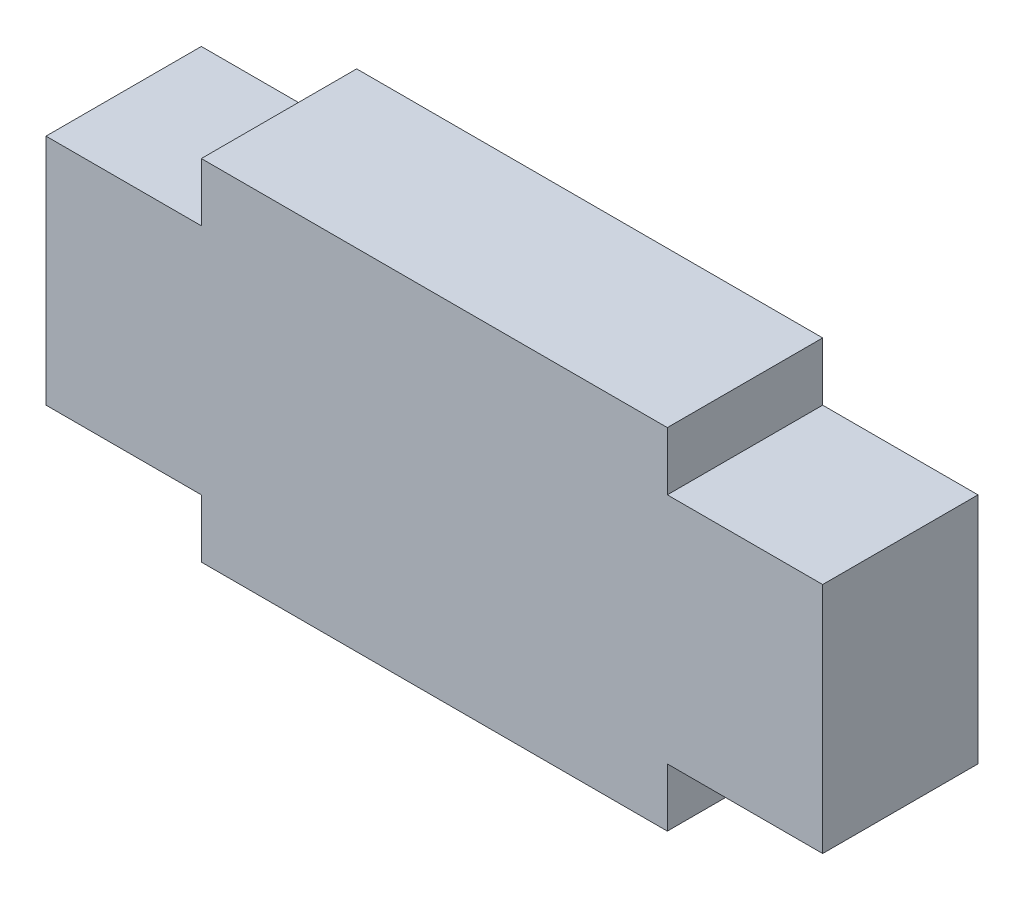
ISO-10303-21;
HEADER;
FILE_DESCRIPTION(('STEP AP214'),'2;1');
FILE_NAME('part.step','',(''),(''),'','','');
FILE_SCHEMA(('AUTOMOTIVE_DESIGN { 1 0 10303 214 1 1 1 1 }'));
ENDSEC;
DATA;
#1=APPLICATION_CONTEXT('core data for automotive mechanical design processes');
#2=APPLICATION_PROTOCOL_DEFINITION('international standard','automotive_design',2000,#1);
#3=PRODUCT_CONTEXT('',#1,'mechanical');
#4=PRODUCT('Part','Part','',(#3));
#5=PRODUCT_RELATED_PRODUCT_CATEGORY('part','',(#4));
#6=PRODUCT_DEFINITION_FORMATION('','',#4);
#7=PRODUCT_DEFINITION_CONTEXT('part definition',#1,'design');
#8=PRODUCT_DEFINITION('design','',#6,#7);
#9=PRODUCT_DEFINITION_SHAPE('','',#8);
#10=(LENGTH_UNIT() NAMED_UNIT(*) SI_UNIT(.MILLI.,.METRE.));
#11=(NAMED_UNIT(*) PLANE_ANGLE_UNIT() SI_UNIT($,.RADIAN.));
#12=(NAMED_UNIT(*) SI_UNIT($,.STERADIAN.) SOLID_ANGLE_UNIT());
#13=UNCERTAINTY_MEASURE_WITH_UNIT(LENGTH_MEASURE(1.E-05),#10,'distance_accuracy_value','');
#14=(GEOMETRIC_REPRESENTATION_CONTEXT(3) GLOBAL_UNCERTAINTY_ASSIGNED_CONTEXT((#13)) GLOBAL_UNIT_ASSIGNED_CONTEXT((#10,
#11,#12)) REPRESENTATION_CONTEXT('',''));
#15=CARTESIAN_POINT('',(0.,0.,0.));
#16=DIRECTION('',(0.,0.,1.));
#17=DIRECTION('',(1.,0.,0.));
#18=AXIS2_PLACEMENT_3D('',#15,#16,#17);
#19=CARTESIAN_POINT('',(4.,0.,4.));
#20=DIRECTION('',(0.,1.,0.));
#21=DIRECTION('',(-1.,0.,0.));
#22=AXIS2_PLACEMENT_3D('',#19,#20,#21);
#23=PLANE('',#22);
#24=DIRECTION('',(1.,0.,0.));
#25=VECTOR('',#24,1.);
#26=CARTESIAN_POINT('',(4.,0.,0.));
#27=LINE('',#26,#25);
#28=CARTESIAN_POINT('',(0.,0.,0.));
#29=VERTEX_POINT('',#28);
#30=CARTESIAN_POINT('',(4.,0.,0.));
#31=VERTEX_POINT('',#30);
#32=EDGE_CURVE('E156',#29,#31,#27,.T.);
#33=ORIENTED_EDGE('',*,*,#32,.T.);
#34=DIRECTION('',(0.,0.,-1.));
#35=VECTOR('',#34,1.);
#36=CARTESIAN_POINT('',(4.,0.,4.));
#37=LINE('',#36,#35);
#38=CARTESIAN_POINT('',(4.,0.,4.));
#39=VERTEX_POINT('',#38);
#40=EDGE_CURVE('E11',#39,#31,#37,.T.);
#41=ORIENTED_EDGE('',*,*,#40,.F.);
#42=DIRECTION('',(1.,0.,0.));
#43=VECTOR('',#42,1.);
#44=CARTESIAN_POINT('',(4.,0.,4.));
#45=LINE('',#44,#43);
#46=CARTESIAN_POINT('',(0.,0.,4.));
#47=VERTEX_POINT('',#46);
#48=EDGE_CURVE('E178',#47,#39,#45,.T.);
#49=ORIENTED_EDGE('',*,*,#48,.F.);
#50=DIRECTION('',(0.,0.,-1.));
#51=VECTOR('',#50,1.);
#52=CARTESIAN_POINT('',(0.,0.,4.));
#53=LINE('',#52,#51);
#54=EDGE_CURVE('E152',#47,#29,#53,.T.);
#55=ORIENTED_EDGE('',*,*,#54,.T.);
#56=EDGE_LOOP('',(#33,#41,#49,#55));
#57=FACE_BOUND('',#56,.T.);
#58=ADVANCED_FACE('F36',(#57),#23,.F.);
#59=CARTESIAN_POINT('',(4.,-1.5,4.));
#60=DIRECTION('',(1.,0.,0.));
#61=DIRECTION('',(0.,0.,-1.));
#62=AXIS2_PLACEMENT_3D('',#59,#60,#61);
#63=PLANE('',#62);
#64=DIRECTION('',(0.,-1.,0.));
#65=VECTOR('',#64,1.);
#66=CARTESIAN_POINT('',(4.,-1.5,0.));
#67=LINE('',#66,#65);
#68=CARTESIAN_POINT('',(4.,-1.5,0.));
#69=VERTEX_POINT('',#68);
#70=EDGE_CURVE('E159',#31,#69,#67,.T.);
#71=ORIENTED_EDGE('',*,*,#70,.T.);
#72=DIRECTION('',(0.,0.,-1.));
#73=VECTOR('',#72,1.);
#74=CARTESIAN_POINT('',(4.,-1.5,4.));
#75=LINE('',#74,#73);
#76=CARTESIAN_POINT('',(4.,-1.5,4.));
#77=VERTEX_POINT('',#76);
#78=EDGE_CURVE('E44',#77,#69,#75,.T.);
#79=ORIENTED_EDGE('',*,*,#78,.F.);
#80=DIRECTION('',(0.,-1.,0.));
#81=VECTOR('',#80,1.);
#82=CARTESIAN_POINT('',(4.,-1.5,4.));
#83=LINE('',#82,#81);
#84=EDGE_CURVE('E107',#39,#77,#83,.T.);
#85=ORIENTED_EDGE('',*,*,#84,.F.);
#86=ORIENTED_EDGE('',*,*,#40,.T.);
#87=EDGE_LOOP('',(#71,#79,#85,#86));
#88=FACE_BOUND('',#87,.T.);
#89=ADVANCED_FACE('F256',(#88),#63,.F.);
#90=CARTESIAN_POINT('',(16.,-1.5,4.));
#91=DIRECTION('',(0.,1.,0.));
#92=DIRECTION('',(0.,0.,1.));
#93=AXIS2_PLACEMENT_3D('',#90,#91,#92);
#94=PLANE('',#93);
#95=DIRECTION('',(1.,0.,0.));
#96=VECTOR('',#95,1.);
#97=CARTESIAN_POINT('',(16.,-1.5,0.));
#98=LINE('',#97,#96);
#99=CARTESIAN_POINT('',(16.,-1.5,0.));
#100=VERTEX_POINT('',#99);
#101=EDGE_CURVE('E161',#69,#100,#98,.T.);
#102=ORIENTED_EDGE('',*,*,#101,.T.);
#103=DIRECTION('',(0.,0.,-1.));
#104=VECTOR('',#103,1.);
#105=CARTESIAN_POINT('',(16.,-1.5,4.));
#106=LINE('',#105,#104);
#107=CARTESIAN_POINT('',(16.,-1.5,4.));
#108=VERTEX_POINT('',#107);
#109=EDGE_CURVE('E197',#108,#100,#106,.T.);
#110=ORIENTED_EDGE('',*,*,#109,.F.);
#111=DIRECTION('',(1.,0.,0.));
#112=VECTOR('',#111,1.);
#113=CARTESIAN_POINT('',(16.,-1.5,4.));
#114=LINE('',#113,#112);
#115=EDGE_CURVE('E205',#77,#108,#114,.T.);
#116=ORIENTED_EDGE('',*,*,#115,.F.);
#117=ORIENTED_EDGE('',*,*,#78,.T.);
#118=EDGE_LOOP('',(#102,#110,#116,#117));
#119=FACE_BOUND('',#118,.T.);
#120=ADVANCED_FACE('F203',(#119),#94,.F.);
#121=CARTESIAN_POINT('',(16.,0.,4.));
#122=DIRECTION('',(-1.,0.,0.));
#123=DIRECTION('',(0.,0.,1.));
#124=AXIS2_PLACEMENT_3D('',#121,#122,#123);
#125=PLANE('',#124);
#126=DIRECTION('',(0.,1.,0.));
#127=VECTOR('',#126,1.);
#128=CARTESIAN_POINT('',(16.,0.,0.));
#129=LINE('',#128,#127);
#130=CARTESIAN_POINT('',(16.,0.,0.));
#131=VERTEX_POINT('',#130);
#132=EDGE_CURVE('E163',#100,#131,#129,.T.);
#133=ORIENTED_EDGE('',*,*,#132,.T.);
#134=DIRECTION('',(0.,0.,-1.));
#135=VECTOR('',#134,1.);
#136=CARTESIAN_POINT('',(16.,0.,4.));
#137=LINE('',#136,#135);
#138=CARTESIAN_POINT('',(16.,0.,4.));
#139=VERTEX_POINT('',#138);
#140=EDGE_CURVE('E194',#139,#131,#137,.T.);
#141=ORIENTED_EDGE('',*,*,#140,.F.);
#142=DIRECTION('',(0.,1.,0.));
#143=VECTOR('',#142,1.);
#144=CARTESIAN_POINT('',(16.,0.,4.));
#145=LINE('',#144,#143);
#146=EDGE_CURVE('E223',#108,#139,#145,.T.);
#147=ORIENTED_EDGE('',*,*,#146,.F.);
#148=ORIENTED_EDGE('',*,*,#109,.T.);
#149=EDGE_LOOP('',(#133,#141,#147,#148));
#150=FACE_BOUND('',#149,.T.);
#151=ADVANCED_FACE('F214',(#150),#125,.F.);
#152=CARTESIAN_POINT('',(20.,0.,4.));
#153=DIRECTION('',(0.,1.,0.));
#154=DIRECTION('',(-1.,0.,0.));
#155=AXIS2_PLACEMENT_3D('',#152,#153,#154);
#156=PLANE('',#155);
#157=DIRECTION('',(1.,0.,0.));
#158=VECTOR('',#157,1.);
#159=CARTESIAN_POINT('',(20.,0.,0.));
#160=LINE('',#159,#158);
#161=CARTESIAN_POINT('',(20.,0.,0.));
#162=VERTEX_POINT('',#161);
#163=EDGE_CURVE('E165',#131,#162,#160,.T.);
#164=ORIENTED_EDGE('',*,*,#163,.T.);
#165=DIRECTION('',(0.,0.,-1.));
#166=VECTOR('',#165,1.);
#167=CARTESIAN_POINT('',(20.,0.,4.));
#168=LINE('',#167,#166);
#169=CARTESIAN_POINT('',(20.,0.,4.));
#170=VERTEX_POINT('',#169);
#171=EDGE_CURVE('E191',#170,#162,#168,.T.);
#172=ORIENTED_EDGE('',*,*,#171,.F.);
#173=DIRECTION('',(1.,0.,0.));
#174=VECTOR('',#173,1.);
#175=CARTESIAN_POINT('',(20.,0.,4.));
#176=LINE('',#175,#174);
#177=EDGE_CURVE('E220',#139,#170,#176,.T.);
#178=ORIENTED_EDGE('',*,*,#177,.F.);
#179=ORIENTED_EDGE('',*,*,#140,.T.);
#180=EDGE_LOOP('',(#164,#172,#178,#179));
#181=FACE_BOUND('',#180,.T.);
#182=ADVANCED_FACE('F218',(#181),#156,.F.);
#183=CARTESIAN_POINT('',(20.,6.,4.));
#184=DIRECTION('',(-1.,0.,0.));
#185=DIRECTION('',(0.,0.,1.));
#186=AXIS2_PLACEMENT_3D('',#183,#184,#185);
#187=PLANE('',#186);
#188=DIRECTION('',(0.,1.,0.));
#189=VECTOR('',#188,1.);
#190=CARTESIAN_POINT('',(20.,6.,0.));
#191=LINE('',#190,#189);
#192=CARTESIAN_POINT('',(20.,6.,0.));
#193=VERTEX_POINT('',#192);
#194=EDGE_CURVE('E167',#162,#193,#191,.T.);
#195=ORIENTED_EDGE('',*,*,#194,.T.);
#196=DIRECTION('',(0.,0.,-1.));
#197=VECTOR('',#196,1.);
#198=CARTESIAN_POINT('',(20.,6.,4.));
#199=LINE('',#198,#197);
#200=CARTESIAN_POINT('',(20.,6.,4.));
#201=VERTEX_POINT('',#200);
#202=EDGE_CURVE('E188',#201,#193,#199,.T.);
#203=ORIENTED_EDGE('',*,*,#202,.F.);
#204=DIRECTION('',(0.,1.,0.));
#205=VECTOR('',#204,1.);
#206=CARTESIAN_POINT('',(20.,6.,4.));
#207=LINE('',#206,#205);
#208=EDGE_CURVE('E222',#170,#201,#207,.T.);
#209=ORIENTED_EDGE('',*,*,#208,.F.);
#210=ORIENTED_EDGE('',*,*,#171,.T.);
#211=EDGE_LOOP('',(#195,#203,#209,#210));
#212=FACE_BOUND('',#211,.T.);
#213=ADVANCED_FACE('F269',(#212),#187,.F.);
#214=CARTESIAN_POINT('',(16.,6.,4.));
#215=DIRECTION('',(0.,-1.,0.));
#216=DIRECTION('',(1.,0.,0.));
#217=AXIS2_PLACEMENT_3D('',#214,#215,#216);
#218=PLANE('',#217);
#219=DIRECTION('',(-1.,0.,0.));
#220=VECTOR('',#219,1.);
#221=CARTESIAN_POINT('',(16.,6.,0.));
#222=LINE('',#221,#220);
#223=CARTESIAN_POINT('',(16.,6.,0.));
#224=VERTEX_POINT('',#223);
#225=EDGE_CURVE('E169',#193,#224,#222,.T.);
#226=ORIENTED_EDGE('',*,*,#225,.T.);
#227=DIRECTION('',(0.,0.,-1.));
#228=VECTOR('',#227,1.);
#229=CARTESIAN_POINT('',(16.,6.,4.));
#230=LINE('',#229,#228);
#231=CARTESIAN_POINT('',(16.,6.,4.));
#232=VERTEX_POINT('',#231);
#233=EDGE_CURVE('E185',#232,#224,#230,.T.);
#234=ORIENTED_EDGE('',*,*,#233,.F.);
#235=DIRECTION('',(-1.,0.,0.));
#236=VECTOR('',#235,1.);
#237=CARTESIAN_POINT('',(16.,6.,4.));
#238=LINE('',#237,#236);
#239=EDGE_CURVE('E225',#201,#232,#238,.T.);
#240=ORIENTED_EDGE('',*,*,#239,.F.);
#241=ORIENTED_EDGE('',*,*,#202,.T.);
#242=EDGE_LOOP('',(#226,#234,#240,#241));
#243=FACE_BOUND('',#242,.T.);
#244=ADVANCED_FACE('F272',(#243),#218,.F.);
#245=CARTESIAN_POINT('',(16.,7.5,4.));
#246=DIRECTION('',(-1.,0.,0.));
#247=DIRECTION('',(0.,0.,1.));
#248=AXIS2_PLACEMENT_3D('',#245,#246,#247);
#249=PLANE('',#248);
#250=DIRECTION('',(0.,1.,0.));
#251=VECTOR('',#250,1.);
#252=CARTESIAN_POINT('',(16.,7.5,0.));
#253=LINE('',#252,#251);
#254=CARTESIAN_POINT('',(16.,7.5,0.));
#255=VERTEX_POINT('',#254);
#256=EDGE_CURVE('E171',#224,#255,#253,.T.);
#257=ORIENTED_EDGE('',*,*,#256,.T.);
#258=DIRECTION('',(0.,0.,-1.));
#259=VECTOR('',#258,1.);
#260=CARTESIAN_POINT('',(16.,7.5,4.));
#261=LINE('',#260,#259);
#262=CARTESIAN_POINT('',(16.,7.5,4.));
#263=VERTEX_POINT('',#262);
#264=EDGE_CURVE('E182',#263,#255,#261,.T.);
#265=ORIENTED_EDGE('',*,*,#264,.F.);
#266=DIRECTION('',(0.,1.,0.));
#267=VECTOR('',#266,1.);
#268=CARTESIAN_POINT('',(16.,7.5,4.));
#269=LINE('',#268,#267);
#270=EDGE_CURVE('E231',#232,#263,#269,.T.);
#271=ORIENTED_EDGE('',*,*,#270,.F.);
#272=ORIENTED_EDGE('',*,*,#233,.T.);
#273=EDGE_LOOP('',(#257,#265,#271,#272));
#274=FACE_BOUND('',#273,.T.);
#275=ADVANCED_FACE('F237',(#274),#249,.F.);
#276=CARTESIAN_POINT('',(4.,7.5,4.));
#277=DIRECTION('',(0.,-1.,0.));
#278=DIRECTION('',(0.,0.,-1.));
#279=AXIS2_PLACEMENT_3D('',#276,#277,#278);
#280=PLANE('',#279);
#281=DIRECTION('',(-1.,0.,0.));
#282=VECTOR('',#281,1.);
#283=CARTESIAN_POINT('',(4.,7.5,0.));
#284=LINE('',#283,#282);
#285=CARTESIAN_POINT('',(4.,7.5,0.));
#286=VERTEX_POINT('',#285);
#287=EDGE_CURVE('E173',#255,#286,#284,.T.);
#288=ORIENTED_EDGE('',*,*,#287,.T.);
#289=DIRECTION('',(0.,0.,-1.));
#290=VECTOR('',#289,1.);
#291=CARTESIAN_POINT('',(4.,7.5,4.));
#292=LINE('',#291,#290);
#293=CARTESIAN_POINT('',(4.,7.5,4.));
#294=VERTEX_POINT('',#293);
#295=EDGE_CURVE('E147',#294,#286,#292,.T.);
#296=ORIENTED_EDGE('',*,*,#295,.F.);
#297=DIRECTION('',(-1.,0.,0.));
#298=VECTOR('',#297,1.);
#299=CARTESIAN_POINT('',(4.,7.5,4.));
#300=LINE('',#299,#298);
#301=EDGE_CURVE('E138',#263,#294,#300,.T.);
#302=ORIENTED_EDGE('',*,*,#301,.F.);
#303=ORIENTED_EDGE('',*,*,#264,.T.);
#304=EDGE_LOOP('',(#288,#296,#302,#303));
#305=FACE_BOUND('',#304,.T.);
#306=ADVANCED_FACE('F241',(#305),#280,.F.);
#307=CARTESIAN_POINT('',(4.,6.,4.));
#308=DIRECTION('',(1.,0.,0.));
#309=DIRECTION('',(0.,0.,-1.));
#310=AXIS2_PLACEMENT_3D('',#307,#308,#309);
#311=PLANE('',#310);
#312=DIRECTION('',(0.,-1.,0.));
#313=VECTOR('',#312,1.);
#314=CARTESIAN_POINT('',(4.,6.,0.));
#315=LINE('',#314,#313);
#316=CARTESIAN_POINT('',(4.,6.,0.));
#317=VERTEX_POINT('',#316);
#318=EDGE_CURVE('E146',#286,#317,#315,.T.);
#319=ORIENTED_EDGE('',*,*,#318,.T.);
#320=DIRECTION('',(0.,0.,-1.));
#321=VECTOR('',#320,1.);
#322=CARTESIAN_POINT('',(4.,6.,4.));
#323=LINE('',#322,#321);
#324=CARTESIAN_POINT('',(4.,6.,4.));
#325=VERTEX_POINT('',#324);
#326=EDGE_CURVE('E143',#325,#317,#323,.T.);
#327=ORIENTED_EDGE('',*,*,#326,.F.);
#328=DIRECTION('',(0.,-1.,0.));
#329=VECTOR('',#328,1.);
#330=CARTESIAN_POINT('',(4.,6.,4.));
#331=LINE('',#330,#329);
#332=EDGE_CURVE('E132',#294,#325,#331,.T.);
#333=ORIENTED_EDGE('',*,*,#332,.F.);
#334=ORIENTED_EDGE('',*,*,#295,.T.);
#335=EDGE_LOOP('',(#319,#327,#333,#334));
#336=FACE_BOUND('',#335,.T.);
#337=ADVANCED_FACE('F144',(#336),#311,.F.);
#338=CARTESIAN_POINT('',(0.,6.,4.));
#339=DIRECTION('',(0.,-1.,0.));
#340=DIRECTION('',(0.,0.,-1.));
#341=AXIS2_PLACEMENT_3D('',#338,#339,#340);
#342=PLANE('',#341);
#343=DIRECTION('',(-1.,0.,0.));
#344=VECTOR('',#343,1.);
#345=CARTESIAN_POINT('',(0.,6.,0.));
#346=LINE('',#345,#344);
#347=CARTESIAN_POINT('',(0.,6.,0.));
#348=VERTEX_POINT('',#347);
#349=EDGE_CURVE('E93',#317,#348,#346,.T.);
#350=ORIENTED_EDGE('',*,*,#349,.T.);
#351=DIRECTION('',(0.,0.,-1.));
#352=VECTOR('',#351,1.);
#353=CARTESIAN_POINT('',(0.,6.,4.));
#354=LINE('',#353,#352);
#355=CARTESIAN_POINT('',(0.,6.,4.));
#356=VERTEX_POINT('',#355);
#357=EDGE_CURVE('E148',#356,#348,#354,.T.);
#358=ORIENTED_EDGE('',*,*,#357,.F.);
#359=DIRECTION('',(-1.,0.,0.));
#360=VECTOR('',#359,1.);
#361=CARTESIAN_POINT('',(0.,6.,4.));
#362=LINE('',#361,#360);
#363=EDGE_CURVE('E136',#325,#356,#362,.T.);
#364=ORIENTED_EDGE('',*,*,#363,.F.);
#365=ORIENTED_EDGE('',*,*,#326,.T.);
#366=EDGE_LOOP('',(#350,#358,#364,#365));
#367=FACE_BOUND('',#366,.T.);
#368=ADVANCED_FACE('F150',(#367),#342,.F.);
#369=CARTESIAN_POINT('',(0.,0.,4.));
#370=DIRECTION('',(1.,0.,0.));
#371=DIRECTION('',(0.,0.,-1.));
#372=AXIS2_PLACEMENT_3D('',#369,#370,#371);
#373=PLANE('',#372);
#374=DIRECTION('',(0.,-1.,0.));
#375=VECTOR('',#374,1.);
#376=CARTESIAN_POINT('',(0.,0.,0.));
#377=LINE('',#376,#375);
#378=EDGE_CURVE('E99',#348,#29,#377,.T.);
#379=ORIENTED_EDGE('',*,*,#378,.T.);
#380=ORIENTED_EDGE('',*,*,#54,.F.);
#381=DIRECTION('',(0.,-1.,0.));
#382=VECTOR('',#381,1.);
#383=CARTESIAN_POINT('',(0.,0.,4.));
#384=LINE('',#383,#382);
#385=EDGE_CURVE('E52',#356,#47,#384,.T.);
#386=ORIENTED_EDGE('',*,*,#385,.F.);
#387=ORIENTED_EDGE('',*,*,#357,.T.);
#388=EDGE_LOOP('',(#379,#380,#386,#387));
#389=FACE_BOUND('',#388,.T.);
#390=ADVANCED_FACE('F245',(#389),#373,.F.);
#391=CARTESIAN_POINT('',(0.,0.,4.));
#392=DIRECTION('',(0.,0.,-1.));
#393=DIRECTION('',(-1.,0.,0.));
#394=AXIS2_PLACEMENT_3D('',#391,#392,#393);
#395=PLANE('',#394);
#396=ORIENTED_EDGE('',*,*,#48,.T.);
#397=ORIENTED_EDGE('',*,*,#84,.T.);
#398=ORIENTED_EDGE('',*,*,#115,.T.);
#399=ORIENTED_EDGE('',*,*,#146,.T.);
#400=ORIENTED_EDGE('',*,*,#177,.T.);
#401=ORIENTED_EDGE('',*,*,#208,.T.);
#402=ORIENTED_EDGE('',*,*,#239,.T.);
#403=ORIENTED_EDGE('',*,*,#270,.T.);
#404=ORIENTED_EDGE('',*,*,#301,.T.);
#405=ORIENTED_EDGE('',*,*,#332,.T.);
#406=ORIENTED_EDGE('',*,*,#363,.T.);
#407=ORIENTED_EDGE('',*,*,#385,.T.);
#408=EDGE_LOOP('',(#396,#397,#398,#399,#400,#401,#402,#403,#404,#405,#406,#407));
#409=FACE_BOUND('',#408,.T.);
#410=ADVANCED_FACE('F134',(#409),#395,.F.);
#411=CARTESIAN_POINT('',(0.,0.,0.));
#412=DIRECTION('',(0.,0.,-1.));
#413=DIRECTION('',(-1.,0.,0.));
#414=AXIS2_PLACEMENT_3D('',#411,#412,#413);
#415=PLANE('',#414);
#416=ORIENTED_EDGE('',*,*,#32,.F.);
#417=ORIENTED_EDGE('',*,*,#378,.F.);
#418=ORIENTED_EDGE('',*,*,#349,.F.);
#419=ORIENTED_EDGE('',*,*,#318,.F.);
#420=ORIENTED_EDGE('',*,*,#287,.F.);
#421=ORIENTED_EDGE('',*,*,#256,.F.);
#422=ORIENTED_EDGE('',*,*,#225,.F.);
#423=ORIENTED_EDGE('',*,*,#194,.F.);
#424=ORIENTED_EDGE('',*,*,#163,.F.);
#425=ORIENTED_EDGE('',*,*,#132,.F.);
#426=ORIENTED_EDGE('',*,*,#101,.F.);
#427=ORIENTED_EDGE('',*,*,#70,.F.);
#428=EDGE_LOOP('',(#416,#417,#418,#419,#420,#421,#422,#423,#424,#425,#426,#427));
#429=FACE_BOUND('',#428,.T.);
#430=ADVANCED_FACE('F209',(#429),#415,.T.);
#431=CLOSED_SHELL('',(#58,#89,#120,#151,#182,#213,#244,#275,#306,#337,#368,#390,#410,#430));
#432=MANIFOLD_SOLID_BREP('B2',#431);
#433=ADVANCED_BREP_SHAPE_REPRESENTATION('',(#18,#432),#14);
#434=SHAPE_DEFINITION_REPRESENTATION(#9,#433);
ENDSEC;
END-ISO-10303-21;
